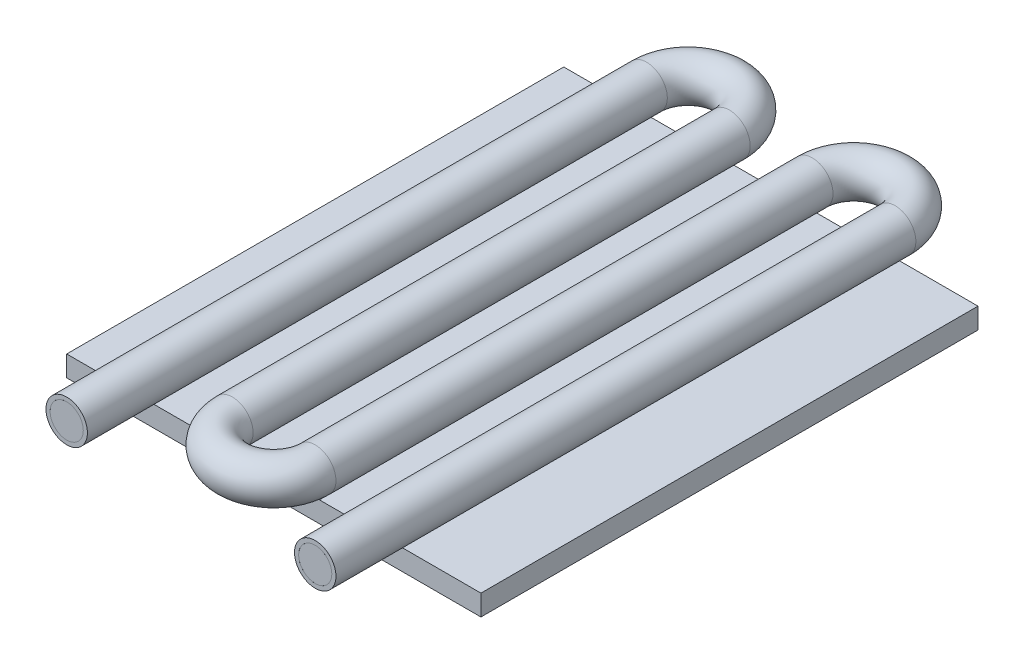
ISO-10303-21;
HEADER;
FILE_DESCRIPTION(('STEP AP214'),'2;1');
FILE_NAME('part.step','',(''),(''),'','','');
FILE_SCHEMA(('AUTOMOTIVE_DESIGN { 1 0 10303 214 1 1 1 1 }'));
ENDSEC;
DATA;
#1=APPLICATION_CONTEXT('core data for automotive mechanical design processes');
#2=APPLICATION_PROTOCOL_DEFINITION('international standard','automotive_design',2000,#1);
#3=PRODUCT_CONTEXT('',#1,'mechanical');
#4=PRODUCT('Part','Part','',(#3));
#5=PRODUCT_RELATED_PRODUCT_CATEGORY('part','',(#4));
#6=PRODUCT_DEFINITION_FORMATION('','',#4);
#7=PRODUCT_DEFINITION_CONTEXT('part definition',#1,'design');
#8=PRODUCT_DEFINITION('design','',#6,#7);
#9=PRODUCT_DEFINITION_SHAPE('','',#8);
#10=(LENGTH_UNIT() NAMED_UNIT(*) SI_UNIT(.MILLI.,.METRE.));
#11=(NAMED_UNIT(*) PLANE_ANGLE_UNIT() SI_UNIT($,.RADIAN.));
#12=(NAMED_UNIT(*) SI_UNIT($,.STERADIAN.) SOLID_ANGLE_UNIT());
#13=UNCERTAINTY_MEASURE_WITH_UNIT(LENGTH_MEASURE(1.E-05),#10,'distance_accuracy_value','');
#14=(GEOMETRIC_REPRESENTATION_CONTEXT(3) GLOBAL_UNCERTAINTY_ASSIGNED_CONTEXT((#13)) GLOBAL_UNIT_ASSIGNED_CONTEXT((#10,
#11,#12)) REPRESENTATION_CONTEXT('',''));
#15=CARTESIAN_POINT('',(0.,0.,0.));
#16=DIRECTION('',(0.,0.,1.));
#17=DIRECTION('',(1.,0.,0.));
#18=AXIS2_PLACEMENT_3D('',#15,#16,#17);
#19=CARTESIAN_POINT('',(60.,22.,155.));
#20=DIRECTION('',(0.,0.,1.));
#21=DIRECTION('',(1.,0.,0.));
#22=AXIS2_PLACEMENT_3D('',#19,#20,#21);
#23=CYLINDRICAL_SURFACE('',#22,8.00000000000001);
#24=CARTESIAN_POINT('',(60.,22.,155.));
#25=DIRECTION('',(0.,0.,1.));
#26=DIRECTION('',(1.,0.,0.));
#27=AXIS2_PLACEMENT_3D('',#24,#25,#26);
#28=CIRCLE('',#27,8.00000000000001);
#29=CARTESIAN_POINT('',(68.,22.,155.));
#30=VERTEX_POINT('',#29);
#31=EDGE_CURVE('E12',#30,#30,#28,.T.);
#32=ORIENTED_EDGE('',*,*,#31,.T.);
#33=EDGE_LOOP('',(#32));
#34=FACE_BOUND('',#33,.T.);
#35=CARTESIAN_POINT('',(60.,22.,160.));
#36=DIRECTION('',(0.,0.,1.));
#37=DIRECTION('',(1.,0.,0.));
#38=AXIS2_PLACEMENT_3D('',#35,#36,#37);
#39=CIRCLE('',#38,8.00000000000001);
#40=CARTESIAN_POINT('',(68.,22.,160.));
#41=VERTEX_POINT('',#40);
#42=EDGE_CURVE('E67',#41,#41,#39,.T.);
#43=ORIENTED_EDGE('',*,*,#42,.F.);
#44=EDGE_LOOP('',(#43));
#45=FACE_BOUND('',#44,.T.);
#46=ADVANCED_FACE('F64',(#34,#45),#23,.T.);
#47=CARTESIAN_POINT('',(0.,0.,155.));
#48=DIRECTION('',(0.,0.,1.));
#49=DIRECTION('',(1.,0.,0.));
#50=AXIS2_PLACEMENT_3D('',#47,#48,#49);
#51=PLANE('',#50);
#52=ORIENTED_EDGE('',*,*,#31,.F.);
#53=EDGE_LOOP('',(#52));
#54=FACE_BOUND('',#53,.T.);
#55=ADVANCED_FACE('F79',(#54),#51,.F.);
#56=CARTESIAN_POINT('',(0.,0.,160.));
#57=DIRECTION('',(0.,0.,1.));
#58=DIRECTION('',(1.,0.,0.));
#59=AXIS2_PLACEMENT_3D('',#56,#57,#58);
#60=PLANE('',#59);
#61=ORIENTED_EDGE('',*,*,#42,.T.);
#62=EDGE_LOOP('',(#61));
#63=FACE_BOUND('',#62,.T.);
#64=ADVANCED_FACE('F76',(#63),#60,.T.);
#65=CLOSED_SHELL('',(#46,#55,#64));
#66=MANIFOLD_SOLID_BREP('B2',#65);
#67=CARTESIAN_POINT('',(-60.,22.,155.));
#68=DIRECTION('',(0.,0.,1.));
#69=DIRECTION('',(1.,0.,0.));
#70=AXIS2_PLACEMENT_3D('',#67,#68,#69);
#71=CYLINDRICAL_SURFACE('',#70,8.);
#72=CARTESIAN_POINT('',(-60.,22.,155.));
#73=DIRECTION('',(0.,0.,1.));
#74=DIRECTION('',(1.,0.,0.));
#75=AXIS2_PLACEMENT_3D('',#72,#73,#74);
#76=CIRCLE('',#75,8.);
#77=CARTESIAN_POINT('',(-52.,22.,155.));
#78=VERTEX_POINT('',#77);
#79=EDGE_CURVE('E63',#78,#78,#76,.F.);
#80=ORIENTED_EDGE('',*,*,#79,.F.);
#81=EDGE_LOOP('',(#80));
#82=FACE_BOUND('',#81,.T.);
#83=CARTESIAN_POINT('',(-60.,22.,160.));
#84=DIRECTION('',(0.,0.,1.));
#85=DIRECTION('',(1.,0.,0.));
#86=AXIS2_PLACEMENT_3D('',#83,#84,#85);
#87=CIRCLE('',#86,8.);
#88=CARTESIAN_POINT('',(-52.,22.,160.));
#89=VERTEX_POINT('',#88);
#90=EDGE_CURVE('E123',#89,#89,#87,.F.);
#91=ORIENTED_EDGE('',*,*,#90,.T.);
#92=EDGE_LOOP('',(#91));
#93=FACE_BOUND('',#92,.T.);
#94=ADVANCED_FACE('F120',(#82,#93),#71,.T.);
#95=CARTESIAN_POINT('',(0.,0.,155.));
#96=DIRECTION('',(0.,0.,1.));
#97=DIRECTION('',(1.,0.,0.));
#98=AXIS2_PLACEMENT_3D('',#95,#96,#97);
#99=PLANE('',#98);
#100=ORIENTED_EDGE('',*,*,#79,.T.);
#101=EDGE_LOOP('',(#100));
#102=FACE_BOUND('',#101,.T.);
#103=ADVANCED_FACE('F135',(#102),#99,.F.);
#104=CARTESIAN_POINT('',(0.,0.,160.));
#105=DIRECTION('',(0.,0.,1.));
#106=DIRECTION('',(1.,0.,0.));
#107=AXIS2_PLACEMENT_3D('',#104,#105,#106);
#108=PLANE('',#107);
#109=ORIENTED_EDGE('',*,*,#90,.F.);
#110=EDGE_LOOP('',(#109));
#111=FACE_BOUND('',#110,.T.);
#112=ADVANCED_FACE('F133',(#111),#108,.T.);
#113=CLOSED_SHELL('',(#94,#103,#112));
#114=MANIFOLD_SOLID_BREP('B7',#113);
#115=CARTESIAN_POINT('',(0.,10.,0.));
#116=DIRECTION('',(0.,-1.,0.));
#117=DIRECTION('',(0.,0.,-1.));
#118=AXIS2_PLACEMENT_3D('',#115,#116,#117);
#119=PLANE('',#118);
#120=DIRECTION('',(-1.,0.,0.));
#121=VECTOR('',#120,1.);
#122=CARTESIAN_POINT('',(100.,10.,-120.));
#123=LINE('',#122,#121);
#124=CARTESIAN_POINT('',(58.,10.,-120.));
#125=VERTEX_POINT('',#124);
#126=CARTESIAN_POINT('',(22.,10.,-120.));
#127=VERTEX_POINT('',#126);
#128=EDGE_CURVE('E320',#125,#127,#123,.T.);
#129=ORIENTED_EDGE('',*,*,#128,.T.);
#130=DIRECTION('',(0.,0.,1.));
#131=VECTOR('',#130,1.);
#132=CARTESIAN_POINT('',(22.,10.,-125.));
#133=LINE('',#132,#131);
#134=CARTESIAN_POINT('',(22.,10.,120.));
#135=VERTEX_POINT('',#134);
#136=EDGE_CURVE('E187',#127,#135,#133,.T.);
#137=ORIENTED_EDGE('',*,*,#136,.T.);
#138=DIRECTION('',(1.,0.,0.));
#139=VECTOR('',#138,1.);
#140=CARTESIAN_POINT('',(100.,10.,120.));
#141=LINE('',#140,#139);
#142=CARTESIAN_POINT('',(58.,10.,120.));
#143=VERTEX_POINT('',#142);
#144=EDGE_CURVE('E468',#135,#143,#141,.T.);
#145=ORIENTED_EDGE('',*,*,#144,.T.);
#146=DIRECTION('',(0.,0.,1.));
#147=VECTOR('',#146,1.);
#148=CARTESIAN_POINT('',(58.,10.,-125.));
#149=LINE('',#148,#147);
#150=EDGE_CURVE('E381',#125,#143,#149,.T.);
#151=ORIENTED_EDGE('',*,*,#150,.F.);
#152=EDGE_LOOP('',(#129,#137,#145,#151));
#153=FACE_BOUND('',#152,.T.);
#154=ADVANCED_FACE('F172',(#153),#119,.F.);
#155=CARTESIAN_POINT('',(-18.0000000000001,10.,120.));
#156=VERTEX_POINT('',#155);
#157=CARTESIAN_POINT('',(18.,10.,120.));
#158=VERTEX_POINT('',#157);
#159=EDGE_CURVE('E195',#156,#158,#141,.T.);
#160=ORIENTED_EDGE('',*,*,#159,.T.);
#161=DIRECTION('',(0.,0.,1.));
#162=VECTOR('',#161,1.);
#163=CARTESIAN_POINT('',(18.,10.,-125.));
#164=LINE('',#163,#162);
#165=CARTESIAN_POINT('',(18.,10.,-120.));
#166=VERTEX_POINT('',#165);
#167=EDGE_CURVE('E325',#166,#158,#164,.T.);
#168=ORIENTED_EDGE('',*,*,#167,.F.);
#169=CARTESIAN_POINT('',(-18.0000000000001,10.,-120.));
#170=VERTEX_POINT('',#169);
#171=EDGE_CURVE('E310',#166,#170,#123,.T.);
#172=ORIENTED_EDGE('',*,*,#171,.T.);
#173=DIRECTION('',(0.,0.,1.));
#174=VECTOR('',#173,1.);
#175=CARTESIAN_POINT('',(-18.0000000000001,10.,-125.));
#176=LINE('',#175,#174);
#177=EDGE_CURVE('E352',#170,#156,#176,.T.);
#178=ORIENTED_EDGE('',*,*,#177,.T.);
#179=EDGE_LOOP('',(#160,#168,#172,#178));
#180=FACE_BOUND('',#179,.T.);
#181=ADVANCED_FACE('F326',(#180),#119,.F.);
#182=CARTESIAN_POINT('',(100.,10.,-120.));
#183=VERTEX_POINT('',#182);
#184=CARTESIAN_POINT('',(62.,10.,-120.));
#185=VERTEX_POINT('',#184);
#186=EDGE_CURVE('E323',#183,#185,#123,.T.);
#187=ORIENTED_EDGE('',*,*,#186,.T.);
#188=DIRECTION('',(0.,0.,1.));
#189=VECTOR('',#188,1.);
#190=CARTESIAN_POINT('',(62.,10.,-125.));
#191=LINE('',#190,#189);
#192=CARTESIAN_POINT('',(62.,10.,120.));
#193=VERTEX_POINT('',#192);
#194=EDGE_CURVE('E372',#185,#193,#191,.T.);
#195=ORIENTED_EDGE('',*,*,#194,.T.);
#196=CARTESIAN_POINT('',(100.,10.,120.));
#197=VERTEX_POINT('',#196);
#198=EDGE_CURVE('E461',#193,#197,#141,.T.);
#199=ORIENTED_EDGE('',*,*,#198,.T.);
#200=DIRECTION('',(0.,0.,-1.));
#201=VECTOR('',#200,1.);
#202=CARTESIAN_POINT('',(100.,10.,-120.));
#203=LINE('',#202,#201);
#204=EDGE_CURVE('E466',#197,#183,#203,.T.);
#205=ORIENTED_EDGE('',*,*,#204,.T.);
#206=EDGE_LOOP('',(#187,#195,#199,#205));
#207=FACE_BOUND('',#206,.T.);
#208=ADVANCED_FACE('F576',(#207),#119,.F.);
#209=CARTESIAN_POINT('',(-62.,13.,-125.));
#210=DIRECTION('',(-1.,0.,0.));
#211=DIRECTION('',(0.,-1.,0.));
#212=AXIS2_PLACEMENT_3D('',#209,#210,#211);
#213=PLANE('',#212);
#214=DIRECTION('',(0.,-1.,0.));
#215=VECTOR('',#214,1.);
#216=CARTESIAN_POINT('',(-62.,13.,120.));
#217=LINE('',#216,#215);
#218=CARTESIAN_POINT('',(-62.,12.2020410288673,120.));
#219=VERTEX_POINT('',#218);
#220=CARTESIAN_POINT('',(-62.,10.,120.));
#221=VERTEX_POINT('',#220);
#222=EDGE_CURVE('E441',#219,#221,#217,.T.);
#223=ORIENTED_EDGE('',*,*,#222,.F.);
#224=DIRECTION('',(0.,0.,-1.));
#225=VECTOR('',#224,1.);
#226=CARTESIAN_POINT('',(-62.,12.2020410288673,160.));
#227=LINE('',#226,#225);
#228=CARTESIAN_POINT('',(-62.,12.2020410288673,-120.));
#229=VERTEX_POINT('',#228);
#230=EDGE_CURVE('E438',#219,#229,#227,.T.);
#231=ORIENTED_EDGE('',*,*,#230,.T.);
#232=DIRECTION('',(0.,1.,0.));
#233=VECTOR('',#232,1.);
#234=CARTESIAN_POINT('',(-62.,13.,-120.));
#235=LINE('',#234,#233);
#236=CARTESIAN_POINT('',(-62.,10.,-120.));
#237=VERTEX_POINT('',#236);
#238=EDGE_CURVE('E445',#237,#229,#235,.T.);
#239=ORIENTED_EDGE('',*,*,#238,.F.);
#240=DIRECTION('',(0.,0.,1.));
#241=VECTOR('',#240,1.);
#242=CARTESIAN_POINT('',(-62.,10.,-125.));
#243=LINE('',#242,#241);
#244=EDGE_CURVE('E454',#237,#221,#243,.T.);
#245=ORIENTED_EDGE('',*,*,#244,.T.);
#246=EDGE_LOOP('',(#223,#231,#239,#245));
#247=FACE_BOUND('',#246,.T.);
#248=ADVANCED_FACE('F548',(#247),#213,.T.);
#249=CARTESIAN_POINT('',(-58.,13.,-125.));
#250=DIRECTION('',(1.,0.,0.));
#251=DIRECTION('',(0.,0.,-1.));
#252=AXIS2_PLACEMENT_3D('',#249,#250,#251);
#253=PLANE('',#252);
#254=DIRECTION('',(0.,-1.,0.));
#255=VECTOR('',#254,1.);
#256=CARTESIAN_POINT('',(-58.,13.,-120.));
#257=LINE('',#256,#255);
#258=CARTESIAN_POINT('',(-58.,12.2020410288673,-120.));
#259=VERTEX_POINT('',#258);
#260=CARTESIAN_POINT('',(-58.,10.,-120.));
#261=VERTEX_POINT('',#260);
#262=EDGE_CURVE('E442',#259,#261,#257,.T.);
#263=ORIENTED_EDGE('',*,*,#262,.F.);
#264=DIRECTION('',(0.,0.,-1.));
#265=VECTOR('',#264,1.);
#266=CARTESIAN_POINT('',(-58.,12.2020410288673,160.));
#267=LINE('',#266,#265);
#268=CARTESIAN_POINT('',(-58.,12.2020410288673,120.));
#269=VERTEX_POINT('',#268);
#270=EDGE_CURVE('E490',#259,#269,#267,.F.);
#271=ORIENTED_EDGE('',*,*,#270,.T.);
#272=DIRECTION('',(0.,1.,0.));
#273=VECTOR('',#272,1.);
#274=CARTESIAN_POINT('',(-58.,13.,120.));
#275=LINE('',#274,#273);
#276=CARTESIAN_POINT('',(-58.,10.,120.));
#277=VERTEX_POINT('',#276);
#278=EDGE_CURVE('E451',#277,#269,#275,.T.);
#279=ORIENTED_EDGE('',*,*,#278,.F.);
#280=DIRECTION('',(0.,0.,1.));
#281=VECTOR('',#280,1.);
#282=CARTESIAN_POINT('',(-58.,10.,-125.));
#283=LINE('',#282,#281);
#284=EDGE_CURVE('E446',#261,#277,#283,.T.);
#285=ORIENTED_EDGE('',*,*,#284,.F.);
#286=EDGE_LOOP('',(#263,#271,#279,#285));
#287=FACE_BOUND('',#286,.T.);
#288=ADVANCED_FACE('F553',(#287),#253,.T.);
#289=ORIENTED_EDGE('',*,*,#244,.F.);
#290=CARTESIAN_POINT('',(-100.,10.,-120.));
#291=VERTEX_POINT('',#290);
#292=EDGE_CURVE('E469',#237,#291,#123,.T.);
#293=ORIENTED_EDGE('',*,*,#292,.T.);
#294=DIRECTION('',(0.,0.,1.));
#295=VECTOR('',#294,1.);
#296=CARTESIAN_POINT('',(-100.,10.,-120.));
#297=LINE('',#296,#295);
#298=CARTESIAN_POINT('',(-100.,10.,120.));
#299=VERTEX_POINT('',#298);
#300=EDGE_CURVE('E458',#291,#299,#297,.T.);
#301=ORIENTED_EDGE('',*,*,#300,.T.);
#302=EDGE_CURVE('E463',#299,#221,#141,.T.);
#303=ORIENTED_EDGE('',*,*,#302,.T.);
#304=EDGE_LOOP('',(#289,#293,#301,#303));
#305=FACE_BOUND('',#304,.T.);
#306=ADVANCED_FACE('F539',(#305),#119,.F.);
#307=CARTESIAN_POINT('',(-100.,10.,-120.));
#308=DIRECTION('',(1.,0.,0.));
#309=DIRECTION('',(0.,0.,-1.));
#310=AXIS2_PLACEMENT_3D('',#307,#308,#309);
#311=PLANE('',#310);
#312=DIRECTION('',(0.,0.,1.));
#313=VECTOR('',#312,1.);
#314=CARTESIAN_POINT('',(-100.,0.,-120.));
#315=LINE('',#314,#313);
#316=CARTESIAN_POINT('',(-100.,0.,-120.));
#317=VERTEX_POINT('',#316);
#318=CARTESIAN_POINT('',(-100.,0.,120.));
#319=VERTEX_POINT('',#318);
#320=EDGE_CURVE('E449',#317,#319,#315,.T.);
#321=ORIENTED_EDGE('',*,*,#320,.T.);
#322=DIRECTION('',(0.,-1.,0.));
#323=VECTOR('',#322,1.);
#324=CARTESIAN_POINT('',(-100.,10.,120.));
#325=LINE('',#324,#323);
#326=EDGE_CURVE('E487',#299,#319,#325,.T.);
#327=ORIENTED_EDGE('',*,*,#326,.F.);
#328=ORIENTED_EDGE('',*,*,#300,.F.);
#329=DIRECTION('',(0.,-1.,0.));
#330=VECTOR('',#329,1.);
#331=CARTESIAN_POINT('',(-100.,10.,-120.));
#332=LINE('',#331,#330);
#333=EDGE_CURVE('E471',#291,#317,#332,.T.);
#334=ORIENTED_EDGE('',*,*,#333,.T.);
#335=EDGE_LOOP('',(#321,#327,#328,#334));
#336=FACE_BOUND('',#335,.T.);
#337=ADVANCED_FACE('F174',(#336),#311,.F.);
#338=CARTESIAN_POINT('',(100.,10.,120.));
#339=DIRECTION('',(0.,0.,-1.));
#340=DIRECTION('',(-1.,0.,0.));
#341=AXIS2_PLACEMENT_3D('',#338,#339,#340);
#342=PLANE('',#341);
#343=CARTESIAN_POINT('',(-60.,22.,120.));
#344=DIRECTION('',(0.,0.,-1.));
#345=DIRECTION('',(-1.,0.,0.));
#346=AXIS2_PLACEMENT_3D('',#343,#344,#345);
#347=CIRCLE('',#346,10.);
#348=EDGE_CURVE('E436',#219,#269,#347,.F.);
#349=ORIENTED_EDGE('',*,*,#348,.F.);
#350=ORIENTED_EDGE('',*,*,#222,.T.);
#351=ORIENTED_EDGE('',*,*,#302,.F.);
#352=ORIENTED_EDGE('',*,*,#326,.T.);
#353=DIRECTION('',(1.,0.,0.));
#354=VECTOR('',#353,1.);
#355=CARTESIAN_POINT('',(100.,0.,120.));
#356=LINE('',#355,#354);
#357=CARTESIAN_POINT('',(100.,0.,120.));
#358=VERTEX_POINT('',#357);
#359=EDGE_CURVE('E474',#319,#358,#356,.T.);
#360=ORIENTED_EDGE('',*,*,#359,.T.);
#361=DIRECTION('',(0.,-1.,0.));
#362=VECTOR('',#361,1.);
#363=CARTESIAN_POINT('',(100.,10.,120.));
#364=LINE('',#363,#362);
#365=EDGE_CURVE('E484',#197,#358,#364,.T.);
#366=ORIENTED_EDGE('',*,*,#365,.F.);
#367=ORIENTED_EDGE('',*,*,#198,.F.);
#368=DIRECTION('',(0.,1.,0.));
#369=VECTOR('',#368,1.);
#370=CARTESIAN_POINT('',(62.,13.,120.));
#371=LINE('',#370,#369);
#372=CARTESIAN_POINT('',(62.,12.2020410288673,120.));
#373=VERTEX_POINT('',#372);
#374=EDGE_CURVE('E368',#193,#373,#371,.T.);
#375=ORIENTED_EDGE('',*,*,#374,.T.);
#376=CARTESIAN_POINT('',(60.,22.,120.));
#377=DIRECTION('',(0.,0.,1.));
#378=DIRECTION('',(1.,0.,0.));
#379=AXIS2_PLACEMENT_3D('',#376,#377,#378);
#380=CIRCLE('',#379,10.);
#381=CARTESIAN_POINT('',(58.,12.2020410288673,120.));
#382=VERTEX_POINT('',#381);
#383=EDGE_CURVE('E493',#382,#373,#380,.T.);
#384=ORIENTED_EDGE('',*,*,#383,.F.);
#385=DIRECTION('',(0.,-1.,0.));
#386=VECTOR('',#385,1.);
#387=CARTESIAN_POINT('',(58.,13.,120.));
#388=LINE('',#387,#386);
#389=EDGE_CURVE('E378',#382,#143,#388,.T.);
#390=ORIENTED_EDGE('',*,*,#389,.T.);
#391=ORIENTED_EDGE('',*,*,#144,.F.);
#392=DIRECTION('',(0.,1.,0.));
#393=VECTOR('',#392,1.);
#394=CARTESIAN_POINT('',(22.,13.,120.));
#395=LINE('',#394,#393);
#396=CARTESIAN_POINT('',(22.,12.2020410288673,120.));
#397=VERTEX_POINT('',#396);
#398=EDGE_CURVE('E340',#135,#397,#395,.T.);
#399=ORIENTED_EDGE('',*,*,#398,.T.);
#400=CARTESIAN_POINT('',(20.,22.,120.));
#401=DIRECTION('',(0.,0.,1.));
#402=DIRECTION('',(1.,0.,0.));
#403=AXIS2_PLACEMENT_3D('',#400,#401,#402);
#404=CIRCLE('',#403,10.);
#405=CARTESIAN_POINT('',(18.,12.2020410288673,120.));
#406=VERTEX_POINT('',#405);
#407=EDGE_CURVE('E421',#406,#397,#404,.T.);
#408=ORIENTED_EDGE('',*,*,#407,.F.);
#409=DIRECTION('',(0.,-1.,0.));
#410=VECTOR('',#409,1.);
#411=CARTESIAN_POINT('',(18.,13.,120.));
#412=LINE('',#411,#410);
#413=EDGE_CURVE('E329',#406,#158,#412,.T.);
#414=ORIENTED_EDGE('',*,*,#413,.T.);
#415=ORIENTED_EDGE('',*,*,#159,.F.);
#416=DIRECTION('',(0.,1.,0.));
#417=VECTOR('',#416,1.);
#418=CARTESIAN_POINT('',(-18.0000000000001,13.,120.));
#419=LINE('',#418,#417);
#420=CARTESIAN_POINT('',(-18.0000000000001,12.2020410288673,120.));
#421=VERTEX_POINT('',#420);
#422=EDGE_CURVE('E348',#156,#421,#419,.T.);
#423=ORIENTED_EDGE('',*,*,#422,.T.);
#424=CARTESIAN_POINT('',(-20.,22.,120.));
#425=DIRECTION('',(0.,0.,1.));
#426=DIRECTION('',(1.,0.,0.));
#427=AXIS2_PLACEMENT_3D('',#424,#425,#426);
#428=CIRCLE('',#427,10.);
#429=CARTESIAN_POINT('',(-22.0000000000001,12.2020410288673,120.));
#430=VERTEX_POINT('',#429);
#431=EDGE_CURVE('E417',#421,#430,#428,.F.);
#432=ORIENTED_EDGE('',*,*,#431,.T.);
#433=DIRECTION('',(0.,-1.,0.));
#434=VECTOR('',#433,1.);
#435=CARTESIAN_POINT('',(-22.0000000000001,13.,120.));
#436=LINE('',#435,#434);
#437=CARTESIAN_POINT('',(-22.0000000000001,10.,120.));
#438=VERTEX_POINT('',#437);
#439=EDGE_CURVE('E357',#430,#438,#436,.T.);
#440=ORIENTED_EDGE('',*,*,#439,.T.);
#441=EDGE_CURVE('E467',#277,#438,#141,.T.);
#442=ORIENTED_EDGE('',*,*,#441,.F.);
#443=ORIENTED_EDGE('',*,*,#278,.T.);
#444=EDGE_LOOP('',(#349,#350,#351,#352,#360,#366,#367,#375,#384,#390,#391,#399,#408,#414,#415,
#423,#432,#440,#442,#443));
#445=FACE_BOUND('',#444,.T.);
#446=ADVANCED_FACE('F508',(#445),#342,.F.);
#447=CARTESIAN_POINT('',(100.,10.,-120.));
#448=DIRECTION('',(-1.,0.,0.));
#449=DIRECTION('',(0.,0.,1.));
#450=AXIS2_PLACEMENT_3D('',#447,#448,#449);
#451=PLANE('',#450);
#452=DIRECTION('',(0.,0.,-1.));
#453=VECTOR('',#452,1.);
#454=CARTESIAN_POINT('',(100.,0.,-120.));
#455=LINE('',#454,#453);
#456=CARTESIAN_POINT('',(100.,0.,-120.));
#457=VERTEX_POINT('',#456);
#458=EDGE_CURVE('E476',#358,#457,#455,.T.);
#459=ORIENTED_EDGE('',*,*,#458,.T.);
#460=DIRECTION('',(0.,-1.,0.));
#461=VECTOR('',#460,1.);
#462=CARTESIAN_POINT('',(100.,10.,-120.));
#463=LINE('',#462,#461);
#464=EDGE_CURVE('E481',#183,#457,#463,.T.);
#465=ORIENTED_EDGE('',*,*,#464,.F.);
#466=ORIENTED_EDGE('',*,*,#204,.F.);
#467=ORIENTED_EDGE('',*,*,#365,.T.);
#468=EDGE_LOOP('',(#459,#465,#466,#467));
#469=FACE_BOUND('',#468,.T.);
#470=ADVANCED_FACE('F587',(#469),#451,.F.);
#471=CARTESIAN_POINT('',(100.,10.,-120.));
#472=DIRECTION('',(0.,0.,1.));
#473=DIRECTION('',(1.,0.,0.));
#474=AXIS2_PLACEMENT_3D('',#471,#472,#473);
#475=PLANE('',#474);
#476=CARTESIAN_POINT('',(-60.,22.,-120.));
#477=DIRECTION('',(0.,0.,-1.));
#478=DIRECTION('',(-1.,0.,0.));
#479=AXIS2_PLACEMENT_3D('',#476,#477,#478);
#480=CIRCLE('',#479,10.);
#481=EDGE_CURVE('E409',#229,#259,#480,.F.);
#482=ORIENTED_EDGE('',*,*,#481,.T.);
#483=ORIENTED_EDGE('',*,*,#262,.T.);
#484=CARTESIAN_POINT('',(-22.0000000000001,10.,-120.));
#485=VERTEX_POINT('',#484);
#486=EDGE_CURVE('E321',#485,#261,#123,.T.);
#487=ORIENTED_EDGE('',*,*,#486,.F.);
#488=DIRECTION('',(0.,1.,0.));
#489=VECTOR('',#488,1.);
#490=CARTESIAN_POINT('',(-22.0000000000001,13.,-120.));
#491=LINE('',#490,#489);
#492=CARTESIAN_POINT('',(-22.0000000000001,12.2020410288673,-120.));
#493=VERTEX_POINT('',#492);
#494=EDGE_CURVE('E349',#485,#493,#491,.T.);
#495=ORIENTED_EDGE('',*,*,#494,.T.);
#496=CARTESIAN_POINT('',(-20.,22.,-120.));
#497=DIRECTION('',(0.,0.,-1.));
#498=DIRECTION('',(-1.,0.,0.));
#499=AXIS2_PLACEMENT_3D('',#496,#497,#498);
#500=CIRCLE('',#499,10.);
#501=CARTESIAN_POINT('',(-18.0000000000001,12.2020410288673,-120.));
#502=VERTEX_POINT('',#501);
#503=EDGE_CURVE('E413',#502,#493,#500,.T.);
#504=ORIENTED_EDGE('',*,*,#503,.F.);
#505=DIRECTION('',(0.,-1.,0.));
#506=VECTOR('',#505,1.);
#507=CARTESIAN_POINT('',(-18.0000000000001,13.,-120.));
#508=LINE('',#507,#506);
#509=EDGE_CURVE('E318',#502,#170,#508,.T.);
#510=ORIENTED_EDGE('',*,*,#509,.T.);
#511=ORIENTED_EDGE('',*,*,#171,.F.);
#512=DIRECTION('',(0.,1.,0.));
#513=VECTOR('',#512,1.);
#514=CARTESIAN_POINT('',(18.,13.,-120.));
#515=LINE('',#514,#513);
#516=CARTESIAN_POINT('',(18.,12.2020410288673,-120.));
#517=VERTEX_POINT('',#516);
#518=EDGE_CURVE('E315',#166,#517,#515,.T.);
#519=ORIENTED_EDGE('',*,*,#518,.T.);
#520=CARTESIAN_POINT('',(20.,22.,-120.));
#521=DIRECTION('',(0.,0.,-1.));
#522=DIRECTION('',(-1.,0.,0.));
#523=AXIS2_PLACEMENT_3D('',#520,#521,#522);
#524=CIRCLE('',#523,10.);
#525=CARTESIAN_POINT('',(22.,12.2020410288673,-120.));
#526=VERTEX_POINT('',#525);
#527=EDGE_CURVE('E425',#517,#526,#524,.F.);
#528=ORIENTED_EDGE('',*,*,#527,.T.);
#529=DIRECTION('',(0.,-1.,0.));
#530=VECTOR('',#529,1.);
#531=CARTESIAN_POINT('',(22.,13.,-120.));
#532=LINE('',#531,#530);
#533=EDGE_CURVE('E334',#526,#127,#532,.T.);
#534=ORIENTED_EDGE('',*,*,#533,.T.);
#535=ORIENTED_EDGE('',*,*,#128,.F.);
#536=DIRECTION('',(0.,1.,0.));
#537=VECTOR('',#536,1.);
#538=CARTESIAN_POINT('',(58.,13.,-120.));
#539=LINE('',#538,#537);
#540=CARTESIAN_POINT('',(58.,12.2020410288673,-120.));
#541=VERTEX_POINT('',#540);
#542=EDGE_CURVE('E369',#125,#541,#539,.T.);
#543=ORIENTED_EDGE('',*,*,#542,.T.);
#544=CARTESIAN_POINT('',(60.,22.,-120.));
#545=DIRECTION('',(0.,0.,-1.));
#546=DIRECTION('',(-1.,0.,0.));
#547=AXIS2_PLACEMENT_3D('',#544,#545,#546);
#548=CIRCLE('',#547,10.);
#549=CARTESIAN_POINT('',(62.,12.2020410288673,-120.));
#550=VERTEX_POINT('',#549);
#551=EDGE_CURVE('E428',#550,#541,#548,.T.);
#552=ORIENTED_EDGE('',*,*,#551,.F.);
#553=DIRECTION('',(0.,-1.,0.));
#554=VECTOR('',#553,1.);
#555=CARTESIAN_POINT('',(62.,13.,-120.));
#556=LINE('',#555,#554);
#557=EDGE_CURVE('E371',#550,#185,#556,.T.);
#558=ORIENTED_EDGE('',*,*,#557,.T.);
#559=ORIENTED_EDGE('',*,*,#186,.F.);
#560=ORIENTED_EDGE('',*,*,#464,.T.);
#561=DIRECTION('',(-1.,0.,0.));
#562=VECTOR('',#561,1.);
#563=CARTESIAN_POINT('',(100.,0.,-120.));
#564=LINE('',#563,#562);
#565=EDGE_CURVE('E462',#457,#317,#564,.T.);
#566=ORIENTED_EDGE('',*,*,#565,.T.);
#567=ORIENTED_EDGE('',*,*,#333,.F.);
#568=ORIENTED_EDGE('',*,*,#292,.F.);
#569=ORIENTED_EDGE('',*,*,#238,.T.);
#570=EDGE_LOOP('',(#482,#483,#487,#495,#504,#510,#511,#519,#528,#534,#535,#543,#552,#558,#559,
#560,#566,#567,#568,#569));
#571=FACE_BOUND('',#570,.T.);
#572=ADVANCED_FACE('F312',(#571),#475,.F.);
#573=ORIENTED_EDGE('',*,*,#441,.T.);
#574=DIRECTION('',(0.,0.,1.));
#575=VECTOR('',#574,1.);
#576=CARTESIAN_POINT('',(-22.0000000000001,10.,-125.));
#577=LINE('',#576,#575);
#578=EDGE_CURVE('E360',#485,#438,#577,.T.);
#579=ORIENTED_EDGE('',*,*,#578,.F.);
#580=ORIENTED_EDGE('',*,*,#486,.T.);
#581=ORIENTED_EDGE('',*,*,#284,.T.);
#582=EDGE_LOOP('',(#573,#579,#580,#581));
#583=FACE_BOUND('',#582,.T.);
#584=ADVANCED_FACE('F526',(#583),#119,.F.);
#585=CARTESIAN_POINT('',(0.,0.,0.));
#586=DIRECTION('',(0.,-1.,0.));
#587=DIRECTION('',(0.,0.,-1.));
#588=AXIS2_PLACEMENT_3D('',#585,#586,#587);
#589=PLANE('',#588);
#590=ORIENTED_EDGE('',*,*,#320,.F.);
#591=ORIENTED_EDGE('',*,*,#565,.F.);
#592=ORIENTED_EDGE('',*,*,#458,.F.);
#593=ORIENTED_EDGE('',*,*,#359,.F.);
#594=EDGE_LOOP('',(#590,#591,#592,#593));
#595=FACE_BOUND('',#594,.T.);
#596=ADVANCED_FACE('F580',(#595),#589,.T.);
#597=CARTESIAN_POINT('',(-60.,22.,160.));
#598=DIRECTION('',(0.,0.,1.));
#599=DIRECTION('',(1.,0.,0.));
#600=AXIS2_PLACEMENT_3D('',#597,#598,#599);
#601=PLANE('',#600);
#602=CARTESIAN_POINT('',(-60.,22.,160.));
#603=DIRECTION('',(0.,0.,1.));
#604=DIRECTION('',(1.,0.,0.));
#605=AXIS2_PLACEMENT_3D('',#602,#603,#604);
#606=CIRCLE('',#605,8.);
#607=CARTESIAN_POINT('',(-52.,22.,160.));
#608=VERTEX_POINT('',#607);
#609=EDGE_CURVE('E375',#608,#608,#606,.T.);
#610=ORIENTED_EDGE('',*,*,#609,.F.);
#611=EDGE_LOOP('',(#610));
#612=FACE_BOUND('',#611,.T.);
#613=CARTESIAN_POINT('',(-60.,22.,160.));
#614=DIRECTION('',(0.,0.,1.));
#615=DIRECTION('',(1.,0.,0.));
#616=AXIS2_PLACEMENT_3D('',#613,#614,#615);
#617=CIRCLE('',#616,10.);
#618=CARTESIAN_POINT('',(-50.,22.,160.));
#619=VERTEX_POINT('',#618);
#620=EDGE_CURVE('E408',#619,#619,#617,.T.);
#621=ORIENTED_EDGE('',*,*,#620,.T.);
#622=EDGE_LOOP('',(#621));
#623=FACE_BOUND('',#622,.T.);
#624=ADVANCED_FACE('F585',(#612,#623),#601,.T.);
#625=CARTESIAN_POINT('',(60.,22.,160.));
#626=DIRECTION('',(0.,0.,-1.));
#627=DIRECTION('',(-1.,0.,0.));
#628=AXIS2_PLACEMENT_3D('',#625,#626,#627);
#629=PLANE('',#628);
#630=CARTESIAN_POINT('',(60.,22.,160.));
#631=DIRECTION('',(0.,0.,-1.));
#632=DIRECTION('',(-1.,0.,0.));
#633=AXIS2_PLACEMENT_3D('',#630,#631,#632);
#634=CIRCLE('',#633,8.);
#635=CARTESIAN_POINT('',(52.,22.,160.));
#636=VERTEX_POINT('',#635);
#637=EDGE_CURVE('E405',#636,#636,#634,.T.);
#638=ORIENTED_EDGE('',*,*,#637,.T.);
#639=EDGE_LOOP('',(#638));
#640=FACE_BOUND('',#639,.T.);
#641=CARTESIAN_POINT('',(60.,22.,160.));
#642=DIRECTION('',(0.,0.,-1.));
#643=DIRECTION('',(-1.,0.,0.));
#644=AXIS2_PLACEMENT_3D('',#641,#642,#643);
#645=CIRCLE('',#644,10.);
#646=CARTESIAN_POINT('',(50.,22.,160.));
#647=VERTEX_POINT('',#646);
#648=EDGE_CURVE('E431',#647,#647,#645,.T.);
#649=ORIENTED_EDGE('',*,*,#648,.F.);
#650=EDGE_LOOP('',(#649));
#651=FACE_BOUND('',#650,.T.);
#652=ADVANCED_FACE('F569',(#640,#651),#629,.F.);
#653=CARTESIAN_POINT('',(-60.,22.,160.));
#654=DIRECTION('',(0.,0.,-1.));
#655=DIRECTION('',(-1.,0.,0.));
#656=AXIS2_PLACEMENT_3D('',#653,#654,#655);
#657=CYLINDRICAL_SURFACE('',#656,10.);
#658=ORIENTED_EDGE('',*,*,#230,.F.);
#659=ORIENTED_EDGE('',*,*,#348,.T.);
#660=ORIENTED_EDGE('',*,*,#270,.F.);
#661=EDGE_CURVE('E412',#259,#229,#480,.F.);
#662=ORIENTED_EDGE('',*,*,#661,.T.);
#663=EDGE_LOOP('',(#658,#659,#660,#662));
#664=FACE_BOUND('',#663,.T.);
#665=ORIENTED_EDGE('',*,*,#620,.F.);
#666=EDGE_LOOP('',(#665));
#667=FACE_BOUND('',#666,.T.);
#668=ADVANCED_FACE('F555',(#664,#667),#657,.T.);
#669=CARTESIAN_POINT('',(-40.,22.,-120.));
#670=DIRECTION('',(0.,-1.,0.));
#671=DIRECTION('',(0.,0.,-1.));
#672=AXIS2_PLACEMENT_3D('',#669,#670,#671);
#673=TOROIDAL_SURFACE('',#672,20.,10.);
#674=ORIENTED_EDGE('',*,*,#503,.T.);
#675=EDGE_CURVE('E411',#493,#502,#500,.T.);
#676=ORIENTED_EDGE('',*,*,#675,.T.);
#677=EDGE_LOOP('',(#674,#676));
#678=FACE_BOUND('',#677,.T.);
#679=ORIENTED_EDGE('',*,*,#481,.F.);
#680=ORIENTED_EDGE('',*,*,#661,.F.);
#681=EDGE_LOOP('',(#679,#680));
#682=FACE_BOUND('',#681,.T.);
#683=ADVANCED_FACE('F557',(#678,#682),#673,.T.);
#684=CARTESIAN_POINT('',(-20.,22.,-120.));
#685=DIRECTION('',(0.,0.,1.));
#686=DIRECTION('',(1.,0.,0.));
#687=AXIS2_PLACEMENT_3D('',#684,#685,#686);
#688=CYLINDRICAL_SURFACE('',#687,10.);
#689=EDGE_CURVE('E416',#430,#421,#428,.F.);
#690=ORIENTED_EDGE('',*,*,#689,.T.);
#691=DIRECTION('',(0.,0.,1.));
#692=VECTOR('',#691,1.);
#693=CARTESIAN_POINT('',(-18.0000000000001,12.2020410288673,-120.));
#694=LINE('',#693,#692);
#695=EDGE_CURVE('E366',#421,#502,#694,.F.);
#696=ORIENTED_EDGE('',*,*,#695,.T.);
#697=ORIENTED_EDGE('',*,*,#675,.F.);
#698=DIRECTION('',(0.,0.,1.));
#699=VECTOR('',#698,1.);
#700=CARTESIAN_POINT('',(-22.0000000000001,12.2020410288673,-120.));
#701=LINE('',#700,#699);
#702=EDGE_CURVE('E354',#493,#430,#701,.T.);
#703=ORIENTED_EDGE('',*,*,#702,.T.);
#704=EDGE_LOOP('',(#690,#696,#697,#703));
#705=FACE_BOUND('',#704,.T.);
#706=ADVANCED_FACE('F559',(#705),#688,.T.);
#707=CARTESIAN_POINT('',(0.,22.,120.));
#708=DIRECTION('',(0.,1.,0.));
#709=DIRECTION('',(0.,0.,1.));
#710=AXIS2_PLACEMENT_3D('',#707,#708,#709);
#711=TOROIDAL_SURFACE('',#710,20.,10.);
#712=ORIENTED_EDGE('',*,*,#407,.T.);
#713=EDGE_CURVE('E420',#397,#406,#404,.T.);
#714=ORIENTED_EDGE('',*,*,#713,.T.);
#715=EDGE_LOOP('',(#712,#714));
#716=FACE_BOUND('',#715,.T.);
#717=ORIENTED_EDGE('',*,*,#431,.F.);
#718=ORIENTED_EDGE('',*,*,#689,.F.);
#719=EDGE_LOOP('',(#717,#718));
#720=FACE_BOUND('',#719,.T.);
#721=ADVANCED_FACE('F566',(#716,#720),#711,.T.);
#722=CARTESIAN_POINT('',(20.,22.,120.));
#723=DIRECTION('',(0.,0.,-1.));
#724=DIRECTION('',(-1.,0.,0.));
#725=AXIS2_PLACEMENT_3D('',#722,#723,#724);
#726=CYLINDRICAL_SURFACE('',#725,10.);
#727=ORIENTED_EDGE('',*,*,#713,.F.);
#728=DIRECTION('',(0.,0.,-1.));
#729=VECTOR('',#728,1.);
#730=CARTESIAN_POINT('',(22.,12.2020410288673,120.));
#731=LINE('',#730,#729);
#732=EDGE_CURVE('E345',#397,#526,#731,.T.);
#733=ORIENTED_EDGE('',*,*,#732,.T.);
#734=EDGE_CURVE('E424',#526,#517,#524,.F.);
#735=ORIENTED_EDGE('',*,*,#734,.T.);
#736=DIRECTION('',(0.,0.,-1.));
#737=VECTOR('',#736,1.);
#738=CARTESIAN_POINT('',(18.,12.2020410288673,120.));
#739=LINE('',#738,#737);
#740=EDGE_CURVE('E333',#517,#406,#739,.F.);
#741=ORIENTED_EDGE('',*,*,#740,.T.);
#742=EDGE_LOOP('',(#727,#733,#735,#741));
#743=FACE_BOUND('',#742,.T.);
#744=ADVANCED_FACE('F705',(#743),#726,.T.);
#745=CARTESIAN_POINT('',(40.,22.,-120.));
#746=DIRECTION('',(0.,-1.,0.));
#747=DIRECTION('',(0.,0.,-1.));
#748=AXIS2_PLACEMENT_3D('',#745,#746,#747);
#749=TOROIDAL_SURFACE('',#748,20.,10.);
#750=ORIENTED_EDGE('',*,*,#551,.T.);
#751=EDGE_CURVE('E427',#541,#550,#548,.T.);
#752=ORIENTED_EDGE('',*,*,#751,.T.);
#753=EDGE_LOOP('',(#750,#752));
#754=FACE_BOUND('',#753,.T.);
#755=ORIENTED_EDGE('',*,*,#527,.F.);
#756=ORIENTED_EDGE('',*,*,#734,.F.);
#757=EDGE_LOOP('',(#755,#756));
#758=FACE_BOUND('',#757,.T.);
#759=ADVANCED_FACE('F518',(#754,#758),#749,.T.);
#760=CARTESIAN_POINT('',(60.,22.,-120.));
#761=DIRECTION('',(0.,0.,1.));
#762=DIRECTION('',(1.,0.,0.));
#763=AXIS2_PLACEMENT_3D('',#760,#761,#762);
#764=CYLINDRICAL_SURFACE('',#763,10.);
#765=ORIENTED_EDGE('',*,*,#648,.T.);
#766=EDGE_LOOP('',(#765));
#767=FACE_BOUND('',#766,.T.);
#768=ORIENTED_EDGE('',*,*,#383,.T.);
#769=DIRECTION('',(0.,0.,1.));
#770=VECTOR('',#769,1.);
#771=CARTESIAN_POINT('',(62.,12.2020410288673,-120.));
#772=LINE('',#771,#770);
#773=EDGE_CURVE('E118',#373,#550,#772,.F.);
#774=ORIENTED_EDGE('',*,*,#773,.T.);
#775=ORIENTED_EDGE('',*,*,#751,.F.);
#776=DIRECTION('',(0.,0.,1.));
#777=VECTOR('',#776,1.);
#778=CARTESIAN_POINT('',(58.,12.2020410288673,-120.));
#779=LINE('',#778,#777);
#780=EDGE_CURVE('E180',#541,#382,#779,.T.);
#781=ORIENTED_EDGE('',*,*,#780,.T.);
#782=EDGE_LOOP('',(#768,#774,#775,#781));
#783=FACE_BOUND('',#782,.T.);
#784=ADVANCED_FACE('F499',(#767,#783),#764,.T.);
#785=CARTESIAN_POINT('',(-60.,22.,160.));
#786=DIRECTION('',(0.,0.,-1.));
#787=DIRECTION('',(-1.,0.,0.));
#788=AXIS2_PLACEMENT_3D('',#785,#786,#787);
#789=CYLINDRICAL_SURFACE('',#788,8.);
#790=CARTESIAN_POINT('',(-60.,22.,-120.));
#791=DIRECTION('',(0.,0.,1.));
#792=DIRECTION('',(1.,0.,0.));
#793=AXIS2_PLACEMENT_3D('',#790,#791,#792);
#794=CIRCLE('',#793,8.);
#795=CARTESIAN_POINT('',(-68.,22.,-120.));
#796=VERTEX_POINT('',#795);
#797=EDGE_CURVE('E387',#796,#796,#794,.T.);
#798=ORIENTED_EDGE('',*,*,#797,.F.);
#799=EDGE_LOOP('',(#798));
#800=FACE_BOUND('',#799,.T.);
#801=ORIENTED_EDGE('',*,*,#609,.T.);
#802=EDGE_LOOP('',(#801));
#803=FACE_BOUND('',#802,.T.);
#804=ADVANCED_FACE('F729',(#800,#803),#789,.F.);
#805=CARTESIAN_POINT('',(-40.,22.,-120.));
#806=DIRECTION('',(0.,-1.,0.));
#807=DIRECTION('',(0.,0.,-1.));
#808=AXIS2_PLACEMENT_3D('',#805,#806,#807);
#809=TOROIDAL_SURFACE('',#808,20.,8.);
#810=CARTESIAN_POINT('',(-20.0000000000001,22.,-120.));
#811=DIRECTION('',(0.,0.,-1.));
#812=DIRECTION('',(-1.,0.,0.));
#813=AXIS2_PLACEMENT_3D('',#810,#811,#812);
#814=CIRCLE('',#813,8.);
#815=CARTESIAN_POINT('',(-12.,22.,-120.));
#816=VERTEX_POINT('',#815);
#817=EDGE_CURVE('E390',#816,#816,#814,.T.);
#818=CARTESIAN_POINT('',(-40.,22.,-120.));
#819=DIRECTION('',(0.,-1.,0.));
#820=DIRECTION('',(0.,0.,-1.));
#821=AXIS2_PLACEMENT_3D('',#818,#819,#820);
#822=CIRCLE('',#821,28.);
#823=EDGE_CURVE('',#796,#816,#822,.T.);
#824=ORIENTED_EDGE('',*,*,#797,.T.);
#825=ORIENTED_EDGE('',*,*,#817,.F.);
#826=ORIENTED_EDGE('',*,*,#823,.T.);
#827=ORIENTED_EDGE('',*,*,#823,.F.);
#828=EDGE_LOOP('',(#824,#826,#825,#827));
#829=FACE_BOUND('',#828,.T.);
#830=ADVANCED_FACE('F738',(#829),#809,.F.);
#831=CARTESIAN_POINT('',(-20.,22.,-120.));
#832=DIRECTION('',(0.,0.,1.));
#833=DIRECTION('',(1.,0.,0.));
#834=AXIS2_PLACEMENT_3D('',#831,#832,#833);
#835=CYLINDRICAL_SURFACE('',#834,8.);
#836=CARTESIAN_POINT('',(-20.,22.,120.));
#837=DIRECTION('',(0.,0.,-1.));
#838=DIRECTION('',(-1.,0.,0.));
#839=AXIS2_PLACEMENT_3D('',#836,#837,#838);
#840=CIRCLE('',#839,8.);
#841=CARTESIAN_POINT('',(-28.,22.,120.));
#842=VERTEX_POINT('',#841);
#843=EDGE_CURVE('E393',#842,#842,#840,.T.);
#844=ORIENTED_EDGE('',*,*,#843,.F.);
#845=EDGE_LOOP('',(#844));
#846=FACE_BOUND('',#845,.T.);
#847=ORIENTED_EDGE('',*,*,#817,.T.);
#848=EDGE_LOOP('',(#847));
#849=FACE_BOUND('',#848,.T.);
#850=ADVANCED_FACE('F747',(#846,#849),#835,.F.);
#851=CARTESIAN_POINT('',(0.,22.,120.));
#852=DIRECTION('',(0.,1.,0.));
#853=DIRECTION('',(0.,0.,1.));
#854=AXIS2_PLACEMENT_3D('',#851,#852,#853);
#855=TOROIDAL_SURFACE('',#854,20.,8.);
#856=CARTESIAN_POINT('',(20.,22.,120.));
#857=DIRECTION('',(0.,0.,1.));
#858=DIRECTION('',(1.,0.,0.));
#859=AXIS2_PLACEMENT_3D('',#856,#857,#858);
#860=CIRCLE('',#859,8.);
#861=CARTESIAN_POINT('',(28.,22.,120.));
#862=VERTEX_POINT('',#861);
#863=EDGE_CURVE('E396',#862,#862,#860,.T.);
#864=CARTESIAN_POINT('',(0.,22.,120.));
#865=DIRECTION('',(0.,1.,0.));
#866=DIRECTION('',(0.,0.,1.));
#867=AXIS2_PLACEMENT_3D('',#864,#865,#866);
#868=CIRCLE('',#867,28.);
#869=EDGE_CURVE('',#842,#862,#868,.T.);
#870=ORIENTED_EDGE('',*,*,#843,.T.);
#871=ORIENTED_EDGE('',*,*,#863,.F.);
#872=ORIENTED_EDGE('',*,*,#869,.T.);
#873=ORIENTED_EDGE('',*,*,#869,.F.);
#874=EDGE_LOOP('',(#870,#872,#871,#873));
#875=FACE_BOUND('',#874,.T.);
#876=ADVANCED_FACE('F756',(#875),#855,.F.);
#877=CARTESIAN_POINT('',(20.,22.,120.));
#878=DIRECTION('',(0.,0.,-1.));
#879=DIRECTION('',(-1.,0.,0.));
#880=AXIS2_PLACEMENT_3D('',#877,#878,#879);
#881=CYLINDRICAL_SURFACE('',#880,8.);
#882=CARTESIAN_POINT('',(20.,22.,-120.));
#883=DIRECTION('',(0.,0.,1.));
#884=DIRECTION('',(1.,0.,0.));
#885=AXIS2_PLACEMENT_3D('',#882,#883,#884);
#886=CIRCLE('',#885,8.);
#887=CARTESIAN_POINT('',(12.,22.,-120.));
#888=VERTEX_POINT('',#887);
#889=EDGE_CURVE('E399',#888,#888,#886,.T.);
#890=ORIENTED_EDGE('',*,*,#889,.F.);
#891=EDGE_LOOP('',(#890));
#892=FACE_BOUND('',#891,.T.);
#893=ORIENTED_EDGE('',*,*,#863,.T.);
#894=EDGE_LOOP('',(#893));
#895=FACE_BOUND('',#894,.T.);
#896=ADVANCED_FACE('F765',(#892,#895),#881,.F.);
#897=CARTESIAN_POINT('',(40.,22.,-120.));
#898=DIRECTION('',(0.,-1.,0.));
#899=DIRECTION('',(0.,0.,-1.));
#900=AXIS2_PLACEMENT_3D('',#897,#898,#899);
#901=TOROIDAL_SURFACE('',#900,20.,8.);
#902=CARTESIAN_POINT('',(60.,22.,-120.));
#903=DIRECTION('',(0.,0.,-1.));
#904=DIRECTION('',(-1.,0.,0.));
#905=AXIS2_PLACEMENT_3D('',#902,#903,#904);
#906=CIRCLE('',#905,8.);
#907=CARTESIAN_POINT('',(68.,22.,-120.));
#908=VERTEX_POINT('',#907);
#909=EDGE_CURVE('E402',#908,#908,#906,.T.);
#910=CARTESIAN_POINT('',(40.,22.,-120.));
#911=DIRECTION('',(0.,-1.,0.));
#912=DIRECTION('',(0.,0.,-1.));
#913=AXIS2_PLACEMENT_3D('',#910,#911,#912);
#914=CIRCLE('',#913,28.);
#915=EDGE_CURVE('',#888,#908,#914,.T.);
#916=ORIENTED_EDGE('',*,*,#889,.T.);
#917=ORIENTED_EDGE('',*,*,#909,.F.);
#918=ORIENTED_EDGE('',*,*,#915,.T.);
#919=ORIENTED_EDGE('',*,*,#915,.F.);
#920=EDGE_LOOP('',(#916,#918,#917,#919));
#921=FACE_BOUND('',#920,.T.);
#922=ADVANCED_FACE('F774',(#921),#901,.F.);
#923=CARTESIAN_POINT('',(60.,22.,-120.));
#924=DIRECTION('',(0.,0.,1.));
#925=DIRECTION('',(1.,0.,0.));
#926=AXIS2_PLACEMENT_3D('',#923,#924,#925);
#927=CYLINDRICAL_SURFACE('',#926,8.);
#928=ORIENTED_EDGE('',*,*,#637,.F.);
#929=EDGE_LOOP('',(#928));
#930=FACE_BOUND('',#929,.T.);
#931=ORIENTED_EDGE('',*,*,#909,.T.);
#932=EDGE_LOOP('',(#931));
#933=FACE_BOUND('',#932,.T.);
#934=ADVANCED_FACE('F676',(#930,#933),#927,.F.);
#935=CARTESIAN_POINT('',(62.,13.,-125.));
#936=DIRECTION('',(1.,0.,0.));
#937=DIRECTION('',(0.,1.,0.));
#938=AXIS2_PLACEMENT_3D('',#935,#936,#937);
#939=PLANE('',#938);
#940=ORIENTED_EDGE('',*,*,#773,.F.);
#941=ORIENTED_EDGE('',*,*,#374,.F.);
#942=ORIENTED_EDGE('',*,*,#194,.F.);
#943=ORIENTED_EDGE('',*,*,#557,.F.);
#944=EDGE_LOOP('',(#940,#941,#942,#943));
#945=FACE_BOUND('',#944,.T.);
#946=ADVANCED_FACE('F515',(#945),#939,.T.);
#947=CARTESIAN_POINT('',(58.,13.,-125.));
#948=DIRECTION('',(-1.,0.,0.));
#949=DIRECTION('',(0.,0.,1.));
#950=AXIS2_PLACEMENT_3D('',#947,#948,#949);
#951=PLANE('',#950);
#952=ORIENTED_EDGE('',*,*,#780,.F.);
#953=ORIENTED_EDGE('',*,*,#542,.F.);
#954=ORIENTED_EDGE('',*,*,#150,.T.);
#955=ORIENTED_EDGE('',*,*,#389,.F.);
#956=EDGE_LOOP('',(#952,#953,#954,#955));
#957=FACE_BOUND('',#956,.T.);
#958=ADVANCED_FACE('F504',(#957),#951,.T.);
#959=CARTESIAN_POINT('',(-18.0000000000001,13.,-125.));
#960=DIRECTION('',(1.,0.,0.));
#961=DIRECTION('',(0.,0.,-1.));
#962=AXIS2_PLACEMENT_3D('',#959,#960,#961);
#963=PLANE('',#962);
#964=ORIENTED_EDGE('',*,*,#695,.F.);
#965=ORIENTED_EDGE('',*,*,#422,.F.);
#966=ORIENTED_EDGE('',*,*,#177,.F.);
#967=ORIENTED_EDGE('',*,*,#509,.F.);
#968=EDGE_LOOP('',(#964,#965,#966,#967));
#969=FACE_BOUND('',#968,.T.);
#970=ADVANCED_FACE('F807',(#969),#963,.T.);
#971=CARTESIAN_POINT('',(-22.0000000000001,13.,-125.));
#972=DIRECTION('',(-1.,0.,0.));
#973=DIRECTION('',(0.,0.,1.));
#974=AXIS2_PLACEMENT_3D('',#971,#972,#973);
#975=PLANE('',#974);
#976=ORIENTED_EDGE('',*,*,#702,.F.);
#977=ORIENTED_EDGE('',*,*,#494,.F.);
#978=ORIENTED_EDGE('',*,*,#578,.T.);
#979=ORIENTED_EDGE('',*,*,#439,.F.);
#980=EDGE_LOOP('',(#976,#977,#978,#979));
#981=FACE_BOUND('',#980,.T.);
#982=ADVANCED_FACE('F534',(#981),#975,.T.);
#983=CARTESIAN_POINT('',(22.,13.,-125.));
#984=DIRECTION('',(1.,0.,0.));
#985=DIRECTION('',(0.,0.,-1.));
#986=AXIS2_PLACEMENT_3D('',#983,#984,#985);
#987=PLANE('',#986);
#988=ORIENTED_EDGE('',*,*,#732,.F.);
#989=ORIENTED_EDGE('',*,*,#398,.F.);
#990=ORIENTED_EDGE('',*,*,#136,.F.);
#991=ORIENTED_EDGE('',*,*,#533,.F.);
#992=EDGE_LOOP('',(#988,#989,#990,#991));
#993=FACE_BOUND('',#992,.T.);
#994=ADVANCED_FACE('F825',(#993),#987,.T.);
#995=CARTESIAN_POINT('',(18.,13.,-125.));
#996=DIRECTION('',(-1.,0.,0.));
#997=DIRECTION('',(0.,0.,1.));
#998=AXIS2_PLACEMENT_3D('',#995,#996,#997);
#999=PLANE('',#998);
#1000=ORIENTED_EDGE('',*,*,#740,.F.);
#1001=ORIENTED_EDGE('',*,*,#518,.F.);
#1002=ORIENTED_EDGE('',*,*,#167,.T.);
#1003=ORIENTED_EDGE('',*,*,#413,.F.);
#1004=EDGE_LOOP('',(#1000,#1001,#1002,#1003));
#1005=FACE_BOUND('',#1004,.T.);
#1006=ADVANCED_FACE('F332',(#1005),#999,.T.);
#1007=CLOSED_SHELL('',(#154,#181,#208,#248,#288,#306,#337,#446,#470,#572,#584,#596,#624,#652,
#668,#683,#706,#721,#744,#759,#784,#804,#830,#850,#876,#896,#922,#934,#946,#958,#970,#982,#994,#1006));
#1008=MANIFOLD_SOLID_BREP('B58',#1007);
#1009=ADVANCED_BREP_SHAPE_REPRESENTATION('',(#18,#66,#114,#1008),#14);
#1010=SHAPE_DEFINITION_REPRESENTATION(#9,#1009);
ENDSEC;
END-ISO-10303-21;
